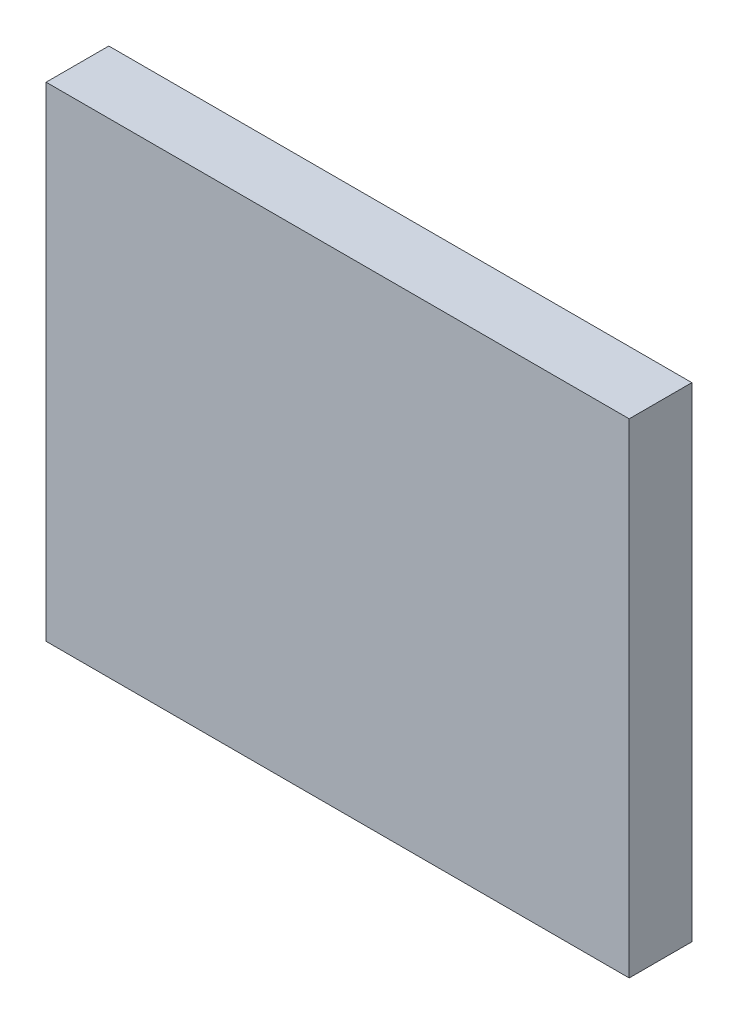
ISO-10303-21;
HEADER;
FILE_DESCRIPTION(('STEP AP214'),'2;1');
FILE_NAME('part.step','',(''),(''),'','','');
FILE_SCHEMA(('AUTOMOTIVE_DESIGN { 1 0 10303 214 1 1 1 1 }'));
ENDSEC;
DATA;
#1=APPLICATION_CONTEXT('core data for automotive mechanical design processes');
#2=APPLICATION_PROTOCOL_DEFINITION('international standard','automotive_design',2000,#1);
#3=PRODUCT_CONTEXT('',#1,'mechanical');
#4=PRODUCT('Part','Part','',(#3));
#5=PRODUCT_RELATED_PRODUCT_CATEGORY('part','',(#4));
#6=PRODUCT_DEFINITION_FORMATION('','',#4);
#7=PRODUCT_DEFINITION_CONTEXT('part definition',#1,'design');
#8=PRODUCT_DEFINITION('design','',#6,#7);
#9=PRODUCT_DEFINITION_SHAPE('','',#8);
#10=(LENGTH_UNIT() NAMED_UNIT(*) SI_UNIT(.MILLI.,.METRE.));
#11=(NAMED_UNIT(*) PLANE_ANGLE_UNIT() SI_UNIT($,.RADIAN.));
#12=(NAMED_UNIT(*) SI_UNIT($,.STERADIAN.) SOLID_ANGLE_UNIT());
#13=UNCERTAINTY_MEASURE_WITH_UNIT(LENGTH_MEASURE(1.E-05),#10,'distance_accuracy_value','');
#14=(GEOMETRIC_REPRESENTATION_CONTEXT(3) GLOBAL_UNCERTAINTY_ASSIGNED_CONTEXT((#13)) GLOBAL_UNIT_ASSIGNED_CONTEXT((#10,
#11,#12)) REPRESENTATION_CONTEXT('',''));
#15=CARTESIAN_POINT('',(0.,0.,0.));
#16=DIRECTION('',(0.,0.,1.));
#17=DIRECTION('',(1.,0.,0.));
#18=AXIS2_PLACEMENT_3D('',#15,#16,#17);
#19=CARTESIAN_POINT('',(-48.9939535172757,38.0205443698732,10.));
#20=DIRECTION('',(1.,0.,0.));
#21=DIRECTION('',(0.,0.,-1.));
#22=AXIS2_PLACEMENT_3D('',#19,#20,#21);
#23=PLANE('',#22);
#24=DIRECTION('',(0.,-1.,0.));
#25=VECTOR('',#24,1.);
#26=CARTESIAN_POINT('',(-48.9939535172757,38.0205443698732,0.));
#27=LINE('',#26,#25);
#28=CARTESIAN_POINT('',(-48.9939535172757,38.0205443698732,0.));
#29=VERTEX_POINT('',#28);
#30=CARTESIAN_POINT('',(-48.9939535172757,-39.2569848371862,0.));
#31=VERTEX_POINT('',#30);
#32=EDGE_CURVE('E98',#29,#31,#27,.T.);
#33=ORIENTED_EDGE('',*,*,#32,.T.);
#34=DIRECTION('',(0.,0.,-1.));
#35=VECTOR('',#34,1.);
#36=CARTESIAN_POINT('',(-48.9939535172757,-39.2569848371862,10.));
#37=LINE('',#36,#35);
#38=CARTESIAN_POINT('',(-48.9939535172757,-39.2569848371862,10.));
#39=VERTEX_POINT('',#38);
#40=EDGE_CURVE('E11',#39,#31,#37,.T.);
#41=ORIENTED_EDGE('',*,*,#40,.F.);
#42=DIRECTION('',(0.,-1.,0.));
#43=VECTOR('',#42,1.);
#44=CARTESIAN_POINT('',(-48.9939535172757,38.0205443698732,10.));
#45=LINE('',#44,#43);
#46=CARTESIAN_POINT('',(-48.9939535172757,38.0205443698732,10.));
#47=VERTEX_POINT('',#46);
#48=EDGE_CURVE('E86',#47,#39,#45,.T.);
#49=ORIENTED_EDGE('',*,*,#48,.F.);
#50=DIRECTION('',(0.,0.,-1.));
#51=VECTOR('',#50,1.);
#52=CARTESIAN_POINT('',(-48.9939535172757,38.0205443698732,10.));
#53=LINE('',#52,#51);
#54=EDGE_CURVE('E94',#47,#29,#53,.T.);
#55=ORIENTED_EDGE('',*,*,#54,.T.);
#56=EDGE_LOOP('',(#33,#41,#49,#55));
#57=FACE_BOUND('',#56,.T.);
#58=ADVANCED_FACE('F35',(#57),#23,.F.);
#59=CARTESIAN_POINT('',(-48.9939535172757,-39.2569848371862,10.));
#60=DIRECTION('',(0.,1.,0.));
#61=DIRECTION('',(0.,0.,1.));
#62=AXIS2_PLACEMENT_3D('',#59,#60,#61);
#63=PLANE('',#62);
#64=DIRECTION('',(1.,0.,0.));
#65=VECTOR('',#64,1.);
#66=CARTESIAN_POINT('',(-48.9939535172757,-39.2569848371862,0.));
#67=LINE('',#66,#65);
#68=CARTESIAN_POINT('',(44.0481916480239,-39.2569848371862,0.));
#69=VERTEX_POINT('',#68);
#70=EDGE_CURVE('E90',#31,#69,#67,.T.);
#71=ORIENTED_EDGE('',*,*,#70,.T.);
#72=DIRECTION('',(0.,0.,-1.));
#73=VECTOR('',#72,1.);
#74=CARTESIAN_POINT('',(44.0481916480239,-39.2569848371862,10.));
#75=LINE('',#74,#73);
#76=CARTESIAN_POINT('',(44.0481916480239,-39.2569848371862,10.));
#77=VERTEX_POINT('',#76);
#78=EDGE_CURVE('E43',#77,#69,#75,.T.);
#79=ORIENTED_EDGE('',*,*,#78,.F.);
#80=DIRECTION('',(1.,0.,0.));
#81=VECTOR('',#80,1.);
#82=CARTESIAN_POINT('',(-48.9939535172757,-39.2569848371862,10.));
#83=LINE('',#82,#81);
#84=EDGE_CURVE('E81',#39,#77,#83,.T.);
#85=ORIENTED_EDGE('',*,*,#84,.F.);
#86=ORIENTED_EDGE('',*,*,#40,.T.);
#87=EDGE_LOOP('',(#71,#79,#85,#86));
#88=FACE_BOUND('',#87,.T.);
#89=ADVANCED_FACE('F89',(#88),#63,.F.);
#90=CARTESIAN_POINT('',(44.0481916480239,38.0205443698732,10.));
#91=DIRECTION('',(-1.,0.,0.));
#92=DIRECTION('',(0.,0.,1.));
#93=AXIS2_PLACEMENT_3D('',#90,#91,#92);
#94=PLANE('',#93);
#95=DIRECTION('',(0.,1.,0.));
#96=VECTOR('',#95,1.);
#97=CARTESIAN_POINT('',(44.0481916480239,38.0205443698732,0.));
#98=LINE('',#97,#96);
#99=CARTESIAN_POINT('',(44.0481916480239,38.0205443698732,0.));
#100=VERTEX_POINT('',#99);
#101=EDGE_CURVE('E68',#69,#100,#98,.T.);
#102=ORIENTED_EDGE('',*,*,#101,.T.);
#103=DIRECTION('',(0.,0.,-1.));
#104=VECTOR('',#103,1.);
#105=CARTESIAN_POINT('',(44.0481916480239,38.0205443698732,10.));
#106=LINE('',#105,#104);
#107=CARTESIAN_POINT('',(44.0481916480239,38.0205443698732,10.));
#108=VERTEX_POINT('',#107);
#109=EDGE_CURVE('E91',#108,#100,#106,.T.);
#110=ORIENTED_EDGE('',*,*,#109,.F.);
#111=DIRECTION('',(0.,1.,0.));
#112=VECTOR('',#111,1.);
#113=CARTESIAN_POINT('',(44.0481916480239,38.0205443698732,10.));
#114=LINE('',#113,#112);
#115=EDGE_CURVE('E84',#77,#108,#114,.T.);
#116=ORIENTED_EDGE('',*,*,#115,.F.);
#117=ORIENTED_EDGE('',*,*,#78,.T.);
#118=EDGE_LOOP('',(#102,#110,#116,#117));
#119=FACE_BOUND('',#118,.T.);
#120=ADVANCED_FACE('F92',(#119),#94,.F.);
#121=CARTESIAN_POINT('',(-48.9939535172757,38.0205443698732,10.));
#122=DIRECTION('',(0.,-1.,0.));
#123=DIRECTION('',(0.,0.,-1.));
#124=AXIS2_PLACEMENT_3D('',#121,#122,#123);
#125=PLANE('',#124);
#126=DIRECTION('',(-1.,0.,0.));
#127=VECTOR('',#126,1.);
#128=CARTESIAN_POINT('',(-48.9939535172757,38.0205443698732,0.));
#129=LINE('',#128,#127);
#130=EDGE_CURVE('E74',#100,#29,#129,.T.);
#131=ORIENTED_EDGE('',*,*,#130,.T.);
#132=ORIENTED_EDGE('',*,*,#54,.F.);
#133=DIRECTION('',(-1.,0.,0.));
#134=VECTOR('',#133,1.);
#135=CARTESIAN_POINT('',(-48.9939535172757,38.0205443698732,10.));
#136=LINE('',#135,#134);
#137=EDGE_CURVE('E51',#108,#47,#136,.T.);
#138=ORIENTED_EDGE('',*,*,#137,.F.);
#139=ORIENTED_EDGE('',*,*,#109,.T.);
#140=EDGE_LOOP('',(#131,#132,#138,#139));
#141=FACE_BOUND('',#140,.T.);
#142=ADVANCED_FACE('F105',(#141),#125,.F.);
#143=CARTESIAN_POINT('',(0.,0.,10.));
#144=DIRECTION('',(0.,0.,1.));
#145=DIRECTION('',(1.,0.,0.));
#146=AXIS2_PLACEMENT_3D('',#143,#144,#145);
#147=PLANE('',#146);
#148=ORIENTED_EDGE('',*,*,#48,.T.);
#149=ORIENTED_EDGE('',*,*,#84,.T.);
#150=ORIENTED_EDGE('',*,*,#115,.T.);
#151=ORIENTED_EDGE('',*,*,#137,.T.);
#152=EDGE_LOOP('',(#148,#149,#150,#151));
#153=FACE_BOUND('',#152,.T.);
#154=ADVANCED_FACE('F82',(#153),#147,.T.);
#155=CARTESIAN_POINT('',(0.,0.,0.));
#156=DIRECTION('',(0.,0.,1.));
#157=DIRECTION('',(1.,0.,0.));
#158=AXIS2_PLACEMENT_3D('',#155,#156,#157);
#159=PLANE('',#158);
#160=ORIENTED_EDGE('',*,*,#32,.F.);
#161=ORIENTED_EDGE('',*,*,#130,.F.);
#162=ORIENTED_EDGE('',*,*,#101,.F.);
#163=ORIENTED_EDGE('',*,*,#70,.F.);
#164=EDGE_LOOP('',(#160,#161,#162,#163));
#165=FACE_BOUND('',#164,.T.);
#166=ADVANCED_FACE('F108',(#165),#159,.F.);
#167=CLOSED_SHELL('',(#58,#89,#120,#142,#154,#166));
#168=MANIFOLD_SOLID_BREP('B2',#167);
#169=ADVANCED_BREP_SHAPE_REPRESENTATION('',(#18,#168),#14);
#170=SHAPE_DEFINITION_REPRESENTATION(#9,#169);
ENDSEC;
END-ISO-10303-21;
